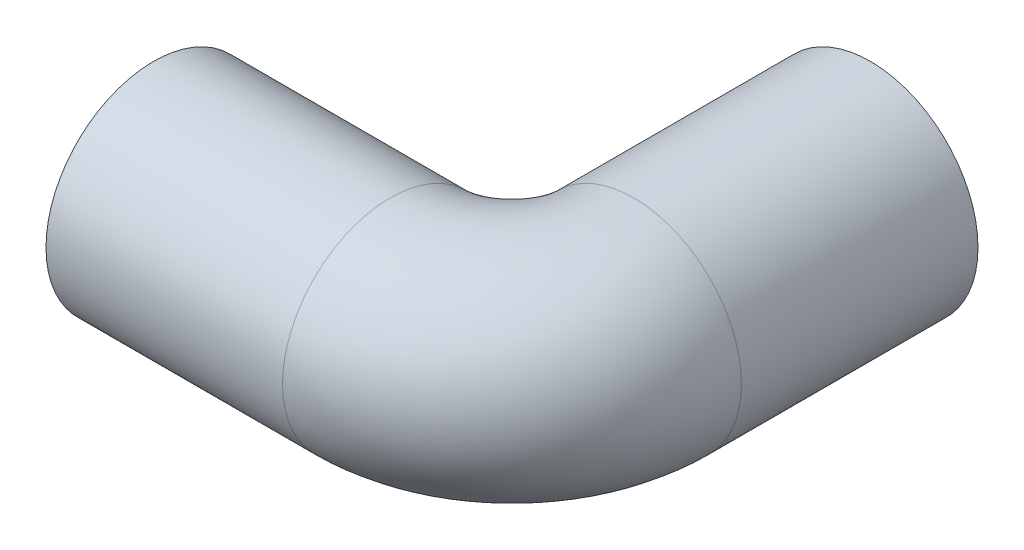
ISO-10303-21;
HEADER;
FILE_DESCRIPTION(('STEP AP214'),'2;1');
FILE_NAME('part.step','',(''),(''),'','','');
FILE_SCHEMA(('AUTOMOTIVE_DESIGN { 1 0 10303 214 1 1 1 1 }'));
ENDSEC;
DATA;
#1=APPLICATION_CONTEXT('core data for automotive mechanical design processes');
#2=APPLICATION_PROTOCOL_DEFINITION('international standard','automotive_design',2000,#1);
#3=PRODUCT_CONTEXT('',#1,'mechanical');
#4=PRODUCT('Part','Part','',(#3));
#5=PRODUCT_RELATED_PRODUCT_CATEGORY('part','',(#4));
#6=PRODUCT_DEFINITION_FORMATION('','',#4);
#7=PRODUCT_DEFINITION_CONTEXT('part definition',#1,'design');
#8=PRODUCT_DEFINITION('design','',#6,#7);
#9=PRODUCT_DEFINITION_SHAPE('','',#8);
#10=(LENGTH_UNIT() NAMED_UNIT(*) SI_UNIT(.MILLI.,.METRE.));
#11=(NAMED_UNIT(*) PLANE_ANGLE_UNIT() SI_UNIT($,.RADIAN.));
#12=(NAMED_UNIT(*) SI_UNIT($,.STERADIAN.) SOLID_ANGLE_UNIT());
#13=UNCERTAINTY_MEASURE_WITH_UNIT(LENGTH_MEASURE(1.E-05),#10,'distance_accuracy_value','');
#14=(GEOMETRIC_REPRESENTATION_CONTEXT(3) GLOBAL_UNCERTAINTY_ASSIGNED_CONTEXT((#13)) GLOBAL_UNIT_ASSIGNED_CONTEXT((#10,
#11,#12)) REPRESENTATION_CONTEXT('',''));
#15=CARTESIAN_POINT('',(0.,0.,0.));
#16=DIRECTION('',(0.,0.,1.));
#17=DIRECTION('',(1.,0.,0.));
#18=AXIS2_PLACEMENT_3D('',#15,#16,#17);
#19=CARTESIAN_POINT('',(-50.,0.,0.));
#20=DIRECTION('',(-1.,0.,0.));
#21=DIRECTION('',(0.,0.,1.));
#22=AXIS2_PLACEMENT_3D('',#19,#20,#21);
#23=PLANE('',#22);
#24=CARTESIAN_POINT('',(-50.,0.,0.));
#25=DIRECTION('',(-1.,0.,0.));
#26=DIRECTION('',(0.,0.,1.));
#27=AXIS2_PLACEMENT_3D('',#24,#25,#26);
#28=CIRCLE('',#27,13.);
#29=CARTESIAN_POINT('',(-50.,0.,13.));
#30=VERTEX_POINT('',#29);
#31=EDGE_CURVE('E72',#30,#30,#28,.T.);
#32=ORIENTED_EDGE('',*,*,#31,.F.);
#33=EDGE_LOOP('',(#32));
#34=FACE_BOUND('',#33,.T.);
#35=CARTESIAN_POINT('',(-50.,0.,0.));
#36=DIRECTION('',(-1.,0.,0.));
#37=DIRECTION('',(0.,0.,1.));
#38=AXIS2_PLACEMENT_3D('',#35,#36,#37);
#39=CIRCLE('',#38,15.);
#40=CARTESIAN_POINT('',(-50.,0.,15.));
#41=VERTEX_POINT('',#40);
#42=EDGE_CURVE('E63',#41,#41,#39,.T.);
#43=ORIENTED_EDGE('',*,*,#42,.T.);
#44=EDGE_LOOP('',(#43));
#45=FACE_BOUND('',#44,.T.);
#46=ADVANCED_FACE('F49',(#34,#45),#23,.T.);
#47=CARTESIAN_POINT('',(0.,0.,-50.));
#48=DIRECTION('',(0.,0.,1.));
#49=DIRECTION('',(1.,0.,0.));
#50=AXIS2_PLACEMENT_3D('',#47,#48,#49);
#51=PLANE('',#50);
#52=CARTESIAN_POINT('',(0.,0.,-50.));
#53=DIRECTION('',(0.,0.,1.));
#54=DIRECTION('',(1.,0.,0.));
#55=AXIS2_PLACEMENT_3D('',#52,#53,#54);
#56=CIRCLE('',#55,13.);
#57=CARTESIAN_POINT('',(13.,0.,-50.));
#58=VERTEX_POINT('',#57);
#59=EDGE_CURVE('E68',#58,#58,#56,.T.);
#60=ORIENTED_EDGE('',*,*,#59,.T.);
#61=EDGE_LOOP('',(#60));
#62=FACE_BOUND('',#61,.T.);
#63=CARTESIAN_POINT('',(0.,0.,-50.));
#64=DIRECTION('',(0.,0.,1.));
#65=DIRECTION('',(1.,0.,0.));
#66=AXIS2_PLACEMENT_3D('',#63,#64,#65);
#67=CIRCLE('',#66,15.);
#68=CARTESIAN_POINT('',(15.,0.,-50.));
#69=VERTEX_POINT('',#68);
#70=EDGE_CURVE('E11',#69,#69,#67,.T.);
#71=ORIENTED_EDGE('',*,*,#70,.F.);
#72=EDGE_LOOP('',(#71));
#73=FACE_BOUND('',#72,.T.);
#74=ADVANCED_FACE('F92',(#62,#73),#51,.F.);
#75=CARTESIAN_POINT('',(-50.,0.,0.));
#76=DIRECTION('',(1.,0.,0.));
#77=DIRECTION('',(0.,0.,-1.));
#78=AXIS2_PLACEMENT_3D('',#75,#76,#77);
#79=CYLINDRICAL_SURFACE('',#78,15.);
#80=CARTESIAN_POINT('',(-17.0000000000001,0.,0.));
#81=DIRECTION('',(-1.,0.,0.));
#82=DIRECTION('',(0.,0.,1.));
#83=AXIS2_PLACEMENT_3D('',#80,#81,#82);
#84=CIRCLE('',#83,15.);
#85=CARTESIAN_POINT('',(-17.0000000000002,0.,15.));
#86=VERTEX_POINT('',#85);
#87=EDGE_CURVE('E59',#86,#86,#84,.T.);
#88=ORIENTED_EDGE('',*,*,#87,.T.);
#89=EDGE_LOOP('',(#88));
#90=FACE_BOUND('',#89,.T.);
#91=ORIENTED_EDGE('',*,*,#42,.F.);
#92=EDGE_LOOP('',(#91));
#93=FACE_BOUND('',#92,.T.);
#94=ADVANCED_FACE('F96',(#90,#93),#79,.T.);
#95=CARTESIAN_POINT('',(-17.,0.,-17.));
#96=DIRECTION('',(0.,1.,0.));
#97=DIRECTION('',(0.,0.,1.));
#98=AXIS2_PLACEMENT_3D('',#95,#96,#97);
#99=TOROIDAL_SURFACE('',#98,17.,15.);
#100=CARTESIAN_POINT('',(3.57148950936401E-13,0.,-17.0000000000001));
#101=DIRECTION('',(0.,0.,1.));
#102=DIRECTION('',(1.,0.,0.));
#103=AXIS2_PLACEMENT_3D('',#100,#101,#102);
#104=CIRCLE('',#103,15.);
#105=CARTESIAN_POINT('',(15.,0.,-17.0000000000002));
#106=VERTEX_POINT('',#105);
#107=EDGE_CURVE('E55',#106,#106,#104,.T.);
#108=CARTESIAN_POINT('',(-17.,0.,-17.));
#109=DIRECTION('',(0.,1.,0.));
#110=DIRECTION('',(0.,0.,1.));
#111=AXIS2_PLACEMENT_3D('',#108,#109,#110);
#112=CIRCLE('',#111,32.);
#113=EDGE_CURVE('',#86,#106,#112,.T.);
#114=ORIENTED_EDGE('',*,*,#87,.F.);
#115=ORIENTED_EDGE('',*,*,#107,.T.);
#116=ORIENTED_EDGE('',*,*,#113,.T.);
#117=ORIENTED_EDGE('',*,*,#113,.F.);
#118=EDGE_LOOP('',(#114,#116,#115,#117));
#119=FACE_BOUND('',#118,.T.);
#120=ADVANCED_FACE('F98',(#119),#99,.T.);
#121=CARTESIAN_POINT('',(0.,0.,-17.0000000000001));
#122=DIRECTION('',(0.,0.,-1.));
#123=DIRECTION('',(-1.,0.,0.));
#124=AXIS2_PLACEMENT_3D('',#121,#122,#123);
#125=CYLINDRICAL_SURFACE('',#124,15.);
#126=ORIENTED_EDGE('',*,*,#70,.T.);
#127=EDGE_LOOP('',(#126));
#128=FACE_BOUND('',#127,.T.);
#129=ORIENTED_EDGE('',*,*,#107,.F.);
#130=EDGE_LOOP('',(#129));
#131=FACE_BOUND('',#130,.T.);
#132=ADVANCED_FACE('F86',(#128,#131),#125,.T.);
#133=CARTESIAN_POINT('',(-50.,0.,0.));
#134=DIRECTION('',(1.,0.,0.));
#135=DIRECTION('',(0.,0.,-1.));
#136=AXIS2_PLACEMENT_3D('',#133,#134,#135);
#137=CYLINDRICAL_SURFACE('',#136,13.);
#138=CARTESIAN_POINT('',(-17.0000000000001,0.,0.));
#139=DIRECTION('',(1.,0.,0.));
#140=DIRECTION('',(0.,0.,-1.));
#141=AXIS2_PLACEMENT_3D('',#138,#139,#140);
#142=CIRCLE('',#141,13.);
#143=CARTESIAN_POINT('',(-17.0000000000002,0.,13.));
#144=VERTEX_POINT('',#143);
#145=EDGE_CURVE('E75',#144,#144,#142,.F.);
#146=ORIENTED_EDGE('',*,*,#145,.F.);
#147=EDGE_LOOP('',(#146));
#148=FACE_BOUND('',#147,.T.);
#149=ORIENTED_EDGE('',*,*,#31,.T.);
#150=EDGE_LOOP('',(#149));
#151=FACE_BOUND('',#150,.T.);
#152=ADVANCED_FACE('F83',(#148,#151),#137,.F.);
#153=CARTESIAN_POINT('',(-17.,0.,-17.));
#154=DIRECTION('',(0.,1.,0.));
#155=DIRECTION('',(0.,0.,1.));
#156=AXIS2_PLACEMENT_3D('',#153,#154,#155);
#157=TOROIDAL_SURFACE('',#156,17.,13.);
#158=CARTESIAN_POINT('',(0.,0.,-17.0000000000011));
#159=DIRECTION('',(0.,0.,1.));
#160=DIRECTION('',(1.,0.,0.));
#161=AXIS2_PLACEMENT_3D('',#158,#159,#160);
#162=CIRCLE('',#161,13.);
#163=CARTESIAN_POINT('',(13.,0.,-17.0000000000019));
#164=VERTEX_POINT('',#163);
#165=EDGE_CURVE('E71',#164,#164,#162,.T.);
#166=CARTESIAN_POINT('',(-17.,0.,-17.));
#167=DIRECTION('',(0.,1.,0.));
#168=DIRECTION('',(0.,0.,1.));
#169=AXIS2_PLACEMENT_3D('',#166,#167,#168);
#170=CIRCLE('',#169,30.);
#171=EDGE_CURVE('',#144,#164,#170,.T.);
#172=ORIENTED_EDGE('',*,*,#145,.T.);
#173=ORIENTED_EDGE('',*,*,#165,.F.);
#174=ORIENTED_EDGE('',*,*,#171,.T.);
#175=ORIENTED_EDGE('',*,*,#171,.F.);
#176=EDGE_LOOP('',(#172,#174,#173,#175));
#177=FACE_BOUND('',#176,.T.);
#178=ADVANCED_FACE('F81',(#177),#157,.F.);
#179=CARTESIAN_POINT('',(0.,0.,-17.0000000000001));
#180=DIRECTION('',(0.,0.,-1.));
#181=DIRECTION('',(-1.,0.,0.));
#182=AXIS2_PLACEMENT_3D('',#179,#180,#181);
#183=CYLINDRICAL_SURFACE('',#182,13.);
#184=ORIENTED_EDGE('',*,*,#59,.F.);
#185=EDGE_LOOP('',(#184));
#186=FACE_BOUND('',#185,.T.);
#187=ORIENTED_EDGE('',*,*,#165,.T.);
#188=EDGE_LOOP('',(#187));
#189=FACE_BOUND('',#188,.T.);
#190=ADVANCED_FACE('F93',(#186,#189),#183,.F.);
#191=CLOSED_SHELL('',(#46,#74,#94,#120,#132,#152,#178,#190));
#192=MANIFOLD_SOLID_BREP('B2',#191);
#193=ADVANCED_BREP_SHAPE_REPRESENTATION('',(#18,#192),#14);
#194=SHAPE_DEFINITION_REPRESENTATION(#9,#193);
ENDSEC;
END-ISO-10303-21;
